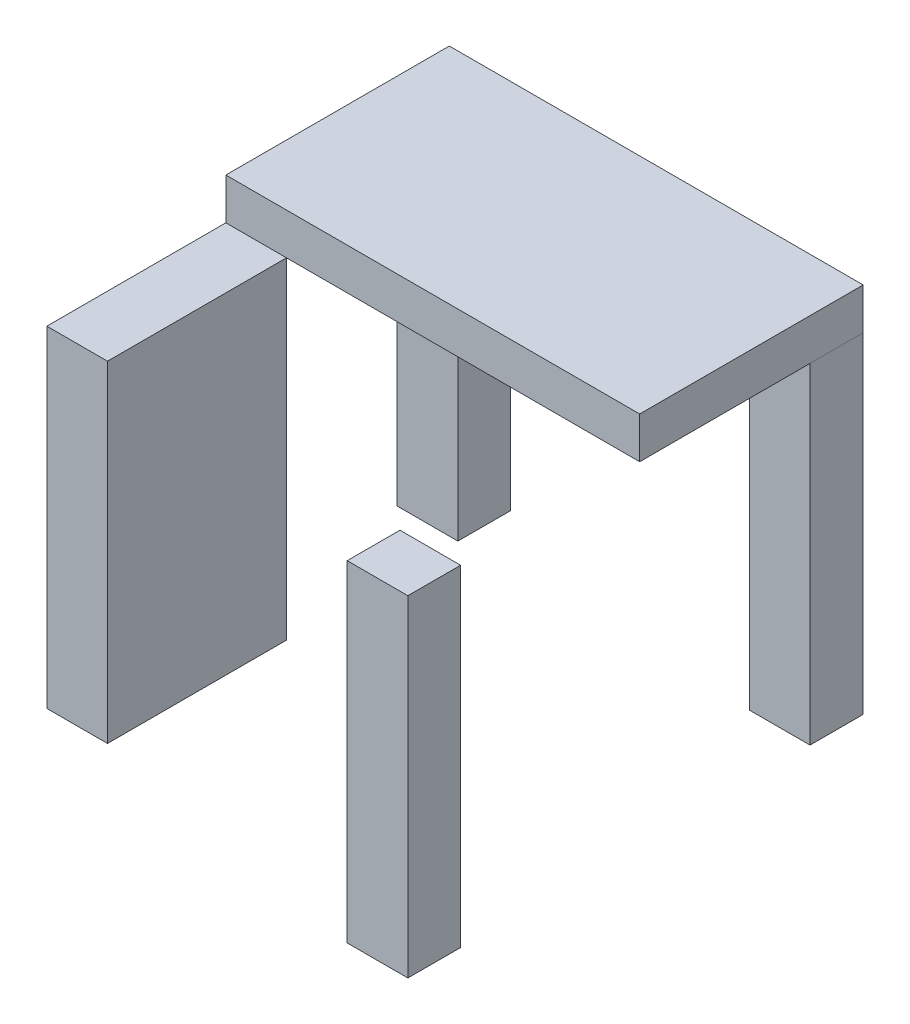
ISO-10303-21;
HEADER;
FILE_DESCRIPTION(('STEP AP214'),'2;1');
FILE_NAME('part.step','',(''),(''),'','','');
FILE_SCHEMA(('AUTOMOTIVE_DESIGN { 1 0 10303 214 1 1 1 1 }'));
ENDSEC;
DATA;
#1=APPLICATION_CONTEXT('core data for automotive mechanical design processes');
#2=APPLICATION_PROTOCOL_DEFINITION('international standard','automotive_design',2000,#1);
#3=PRODUCT_CONTEXT('',#1,'mechanical');
#4=PRODUCT('Part','Part','',(#3));
#5=PRODUCT_RELATED_PRODUCT_CATEGORY('part','',(#4));
#6=PRODUCT_DEFINITION_FORMATION('','',#4);
#7=PRODUCT_DEFINITION_CONTEXT('part definition',#1,'design');
#8=PRODUCT_DEFINITION('design','',#6,#7);
#9=PRODUCT_DEFINITION_SHAPE('','',#8);
#10=(LENGTH_UNIT() NAMED_UNIT(*) SI_UNIT(.MILLI.,.METRE.));
#11=(NAMED_UNIT(*) PLANE_ANGLE_UNIT() SI_UNIT($,.RADIAN.));
#12=(NAMED_UNIT(*) SI_UNIT($,.STERADIAN.) SOLID_ANGLE_UNIT());
#13=UNCERTAINTY_MEASURE_WITH_UNIT(LENGTH_MEASURE(1.E-05),#10,'distance_accuracy_value','');
#14=(GEOMETRIC_REPRESENTATION_CONTEXT(3) GLOBAL_UNCERTAINTY_ASSIGNED_CONTEXT((#13)) GLOBAL_UNIT_ASSIGNED_CONTEXT((#10,
#11,#12)) REPRESENTATION_CONTEXT('',''));
#15=CARTESIAN_POINT('',(0.,0.,0.));
#16=DIRECTION('',(0.,0.,1.));
#17=DIRECTION('',(1.,0.,0.));
#18=AXIS2_PLACEMENT_3D('',#15,#16,#17);
#19=CARTESIAN_POINT('',(85.36181093433,-80.,110.034688240795));
#20=DIRECTION('',(1.,0.,0.));
#21=DIRECTION('',(0.,0.,-1.));
#22=AXIS2_PLACEMENT_3D('',#19,#20,#21);
#23=PLANE('',#22);
#24=DIRECTION('',(0.,0.,-1.));
#25=VECTOR('',#24,1.);
#26=CARTESIAN_POINT('',(85.36181093433,0.,110.034688240795));
#27=LINE('',#26,#25);
#28=CARTESIAN_POINT('',(85.36181093433,0.,110.034688240795));
#29=VERTEX_POINT('',#28);
#30=CARTESIAN_POINT('',(85.36181093433,0.,97.2842820171065));
#31=VERTEX_POINT('',#30);
#32=EDGE_CURVE('E107',#29,#31,#27,.T.);
#33=ORIENTED_EDGE('',*,*,#32,.T.);
#34=DIRECTION('',(0.,1.,0.));
#35=VECTOR('',#34,1.);
#36=CARTESIAN_POINT('',(85.36181093433,-80.,97.2842820171065));
#37=LINE('',#36,#35);
#38=CARTESIAN_POINT('',(85.36181093433,-80.,97.2842820171065));
#39=VERTEX_POINT('',#38);
#40=EDGE_CURVE('E12',#39,#31,#37,.T.);
#41=ORIENTED_EDGE('',*,*,#40,.F.);
#42=DIRECTION('',(0.,0.,-1.));
#43=VECTOR('',#42,1.);
#44=CARTESIAN_POINT('',(85.36181093433,-80.,110.034688240795));
#45=LINE('',#44,#43);
#46=CARTESIAN_POINT('',(85.36181093433,-80.,110.034688240795));
#47=VERTEX_POINT('',#46);
#48=EDGE_CURVE('E95',#47,#39,#45,.T.);
#49=ORIENTED_EDGE('',*,*,#48,.F.);
#50=DIRECTION('',(0.,1.,0.));
#51=VECTOR('',#50,1.);
#52=CARTESIAN_POINT('',(85.36181093433,-80.,110.034688240795));
#53=LINE('',#52,#51);
#54=EDGE_CURVE('E103',#47,#29,#53,.T.);
#55=ORIENTED_EDGE('',*,*,#54,.T.);
#56=EDGE_LOOP('',(#33,#41,#49,#55));
#57=FACE_BOUND('',#56,.T.);
#58=ADVANCED_FACE('F44',(#57),#23,.F.);
#59=CARTESIAN_POINT('',(85.36181093433,-80.,97.2842820171065));
#60=DIRECTION('',(0.,0.,1.));
#61=DIRECTION('',(1.,0.,0.));
#62=AXIS2_PLACEMENT_3D('',#59,#60,#61);
#63=PLANE('',#62);
#64=DIRECTION('',(1.,0.,0.));
#65=VECTOR('',#64,1.);
#66=CARTESIAN_POINT('',(85.36181093433,0.,97.2842820171065));
#67=LINE('',#66,#65);
#68=CARTESIAN_POINT('',(100.019107271016,0.,97.2842820171065));
#69=VERTEX_POINT('',#68);
#70=EDGE_CURVE('E99',#31,#69,#67,.T.);
#71=ORIENTED_EDGE('',*,*,#70,.T.);
#72=DIRECTION('',(0.,1.,0.));
#73=VECTOR('',#72,1.);
#74=CARTESIAN_POINT('',(100.019107271016,-80.,97.2842820171065));
#75=LINE('',#74,#73);
#76=CARTESIAN_POINT('',(100.019107271016,-80.,97.2842820171065));
#77=VERTEX_POINT('',#76);
#78=EDGE_CURVE('E52',#77,#69,#75,.T.);
#79=ORIENTED_EDGE('',*,*,#78,.F.);
#80=DIRECTION('',(1.,0.,0.));
#81=VECTOR('',#80,1.);
#82=CARTESIAN_POINT('',(85.36181093433,-80.,97.2842820171065));
#83=LINE('',#82,#81);
#84=EDGE_CURVE('E90',#39,#77,#83,.T.);
#85=ORIENTED_EDGE('',*,*,#84,.F.);
#86=ORIENTED_EDGE('',*,*,#40,.T.);
#87=EDGE_LOOP('',(#71,#79,#85,#86));
#88=FACE_BOUND('',#87,.T.);
#89=ADVANCED_FACE('F98',(#88),#63,.F.);
#90=CARTESIAN_POINT('',(100.019107271016,-80.,110.034688240795));
#91=DIRECTION('',(-1.,0.,0.));
#92=DIRECTION('',(0.,0.,1.));
#93=AXIS2_PLACEMENT_3D('',#90,#91,#92);
#94=PLANE('',#93);
#95=DIRECTION('',(0.,0.,1.));
#96=VECTOR('',#95,1.);
#97=CARTESIAN_POINT('',(100.019107271016,0.,110.034688240795));
#98=LINE('',#97,#96);
#99=CARTESIAN_POINT('',(100.019107271016,0.,110.034688240795));
#100=VERTEX_POINT('',#99);
#101=EDGE_CURVE('E77',#69,#100,#98,.T.);
#102=ORIENTED_EDGE('',*,*,#101,.T.);
#103=DIRECTION('',(0.,1.,0.));
#104=VECTOR('',#103,1.);
#105=CARTESIAN_POINT('',(100.019107271016,-80.,110.034688240795));
#106=LINE('',#105,#104);
#107=CARTESIAN_POINT('',(100.019107271016,-80.,110.034688240795));
#108=VERTEX_POINT('',#107);
#109=EDGE_CURVE('E100',#108,#100,#106,.T.);
#110=ORIENTED_EDGE('',*,*,#109,.F.);
#111=DIRECTION('',(0.,0.,1.));
#112=VECTOR('',#111,1.);
#113=CARTESIAN_POINT('',(100.019107271016,-80.,110.034688240795));
#114=LINE('',#113,#112);
#115=EDGE_CURVE('E93',#77,#108,#114,.T.);
#116=ORIENTED_EDGE('',*,*,#115,.F.);
#117=ORIENTED_EDGE('',*,*,#78,.T.);
#118=EDGE_LOOP('',(#102,#110,#116,#117));
#119=FACE_BOUND('',#118,.T.);
#120=ADVANCED_FACE('F101',(#119),#94,.F.);
#121=CARTESIAN_POINT('',(85.36181093433,-80.,110.034688240795));
#122=DIRECTION('',(0.,0.,-1.));
#123=DIRECTION('',(-1.,0.,0.));
#124=AXIS2_PLACEMENT_3D('',#121,#122,#123);
#125=PLANE('',#124);
#126=DIRECTION('',(-1.,0.,0.));
#127=VECTOR('',#126,1.);
#128=CARTESIAN_POINT('',(85.36181093433,0.,110.034688240795));
#129=LINE('',#128,#127);
#130=EDGE_CURVE('E83',#100,#29,#129,.T.);
#131=ORIENTED_EDGE('',*,*,#130,.T.);
#132=ORIENTED_EDGE('',*,*,#54,.F.);
#133=DIRECTION('',(-1.,0.,0.));
#134=VECTOR('',#133,1.);
#135=CARTESIAN_POINT('',(85.36181093433,-80.,110.034688240795));
#136=LINE('',#135,#134);
#137=EDGE_CURVE('E60',#108,#47,#136,.T.);
#138=ORIENTED_EDGE('',*,*,#137,.F.);
#139=ORIENTED_EDGE('',*,*,#109,.T.);
#140=EDGE_LOOP('',(#131,#132,#138,#139));
#141=FACE_BOUND('',#140,.T.);
#142=ADVANCED_FACE('F114',(#141),#125,.F.);
#143=CARTESIAN_POINT('',(0.,-80.,0.));
#144=DIRECTION('',(0.,-1.,0.));
#145=DIRECTION('',(0.,0.,-1.));
#146=AXIS2_PLACEMENT_3D('',#143,#144,#145);
#147=PLANE('',#146);
#148=ORIENTED_EDGE('',*,*,#48,.T.);
#149=ORIENTED_EDGE('',*,*,#84,.T.);
#150=ORIENTED_EDGE('',*,*,#115,.T.);
#151=ORIENTED_EDGE('',*,*,#137,.T.);
#152=EDGE_LOOP('',(#148,#149,#150,#151));
#153=FACE_BOUND('',#152,.T.);
#154=ADVANCED_FACE('F91',(#153),#147,.T.);
#155=CARTESIAN_POINT('',(0.,0.,0.));
#156=DIRECTION('',(0.,-1.,0.));
#157=DIRECTION('',(0.,0.,-1.));
#158=AXIS2_PLACEMENT_3D('',#155,#156,#157);
#159=PLANE('',#158);
#160=ORIENTED_EDGE('',*,*,#32,.F.);
#161=ORIENTED_EDGE('',*,*,#130,.F.);
#162=ORIENTED_EDGE('',*,*,#101,.F.);
#163=ORIENTED_EDGE('',*,*,#70,.F.);
#164=EDGE_LOOP('',(#160,#161,#162,#163));
#165=FACE_BOUND('',#164,.T.);
#166=ADVANCED_FACE('F117',(#165),#159,.F.);
#167=CLOSED_SHELL('',(#58,#89,#120,#142,#154,#166));
#168=MANIFOLD_SOLID_BREP('B2',#167);
#169=CARTESIAN_POINT('',(0.,-80.,54.));
#170=DIRECTION('',(1.,0.,0.));
#171=DIRECTION('',(0.,0.,-1.));
#172=AXIS2_PLACEMENT_3D('',#169,#170,#171);
#173=PLANE('',#172);
#174=DIRECTION('',(0.,0.,-1.));
#175=VECTOR('',#174,1.);
#176=CARTESIAN_POINT('',(0.,0.,54.));
#177=LINE('',#176,#175);
#178=CARTESIAN_POINT('',(0.,0.,97.2495937763114));
#179=VERTEX_POINT('',#178);
#180=CARTESIAN_POINT('',(0.,0.,54.));
#181=VERTEX_POINT('',#180);
#182=EDGE_CURVE('E240',#179,#181,#177,.T.);
#183=ORIENTED_EDGE('',*,*,#182,.T.);
#184=DIRECTION('',(0.,1.,0.));
#185=VECTOR('',#184,1.);
#186=CARTESIAN_POINT('',(0.,-80.,54.));
#187=LINE('',#186,#185);
#188=CARTESIAN_POINT('',(0.,-80.,54.));
#189=VERTEX_POINT('',#188);
#190=EDGE_CURVE('E42',#189,#181,#187,.T.);
#191=ORIENTED_EDGE('',*,*,#190,.F.);
#192=DIRECTION('',(0.,0.,-1.));
#193=VECTOR('',#192,1.);
#194=CARTESIAN_POINT('',(0.,-80.,54.));
#195=LINE('',#194,#193);
#196=CARTESIAN_POINT('',(0.,-80.,97.2495937763114));
#197=VERTEX_POINT('',#196);
#198=EDGE_CURVE('E228',#197,#189,#195,.T.);
#199=ORIENTED_EDGE('',*,*,#198,.F.);
#200=DIRECTION('',(0.,1.,0.));
#201=VECTOR('',#200,1.);
#202=CARTESIAN_POINT('',(0.,-80.,97.2495937763114));
#203=LINE('',#202,#201);
#204=EDGE_CURVE('E236',#197,#179,#203,.T.);
#205=ORIENTED_EDGE('',*,*,#204,.T.);
#206=EDGE_LOOP('',(#183,#191,#199,#205));
#207=FACE_BOUND('',#206,.T.);
#208=ADVANCED_FACE('F177',(#207),#173,.F.);
#209=CARTESIAN_POINT('',(0.,-80.,54.));
#210=DIRECTION('',(0.,0.,1.));
#211=DIRECTION('',(1.,0.,0.));
#212=AXIS2_PLACEMENT_3D('',#209,#210,#211);
#213=PLANE('',#212);
#214=DIRECTION('',(1.,0.,0.));
#215=VECTOR('',#214,1.);
#216=CARTESIAN_POINT('',(0.,0.,54.));
#217=LINE('',#216,#215);
#218=CARTESIAN_POINT('',(14.6572963366857,0.,54.));
#219=VERTEX_POINT('',#218);
#220=EDGE_CURVE('E232',#181,#219,#217,.T.);
#221=ORIENTED_EDGE('',*,*,#220,.T.);
#222=DIRECTION('',(0.,1.,0.));
#223=VECTOR('',#222,1.);
#224=CARTESIAN_POINT('',(14.6572963366857,-80.,54.));
#225=LINE('',#224,#223);
#226=CARTESIAN_POINT('',(14.6572963366857,-80.,54.));
#227=VERTEX_POINT('',#226);
#228=EDGE_CURVE('E185',#227,#219,#225,.T.);
#229=ORIENTED_EDGE('',*,*,#228,.F.);
#230=DIRECTION('',(1.,0.,0.));
#231=VECTOR('',#230,1.);
#232=CARTESIAN_POINT('',(0.,-80.,54.));
#233=LINE('',#232,#231);
#234=EDGE_CURVE('E223',#189,#227,#233,.T.);
#235=ORIENTED_EDGE('',*,*,#234,.F.);
#236=ORIENTED_EDGE('',*,*,#190,.T.);
#237=EDGE_LOOP('',(#221,#229,#235,#236));
#238=FACE_BOUND('',#237,.T.);
#239=ADVANCED_FACE('F231',(#238),#213,.F.);
#240=CARTESIAN_POINT('',(14.6572963366857,-80.,54.));
#241=DIRECTION('',(-1.,0.,0.));
#242=DIRECTION('',(0.,0.,1.));
#243=AXIS2_PLACEMENT_3D('',#240,#241,#242);
#244=PLANE('',#243);
#245=DIRECTION('',(0.,0.,1.));
#246=VECTOR('',#245,1.);
#247=CARTESIAN_POINT('',(14.6572963366857,0.,54.));
#248=LINE('',#247,#246);
#249=CARTESIAN_POINT('',(14.6572963366857,0.,97.2495937763114));
#250=VERTEX_POINT('',#249);
#251=EDGE_CURVE('E210',#219,#250,#248,.T.);
#252=ORIENTED_EDGE('',*,*,#251,.T.);
#253=DIRECTION('',(0.,1.,0.));
#254=VECTOR('',#253,1.);
#255=CARTESIAN_POINT('',(14.6572963366857,-80.,97.2495937763114));
#256=LINE('',#255,#254);
#257=CARTESIAN_POINT('',(14.6572963366857,-80.,97.2495937763114));
#258=VERTEX_POINT('',#257);
#259=EDGE_CURVE('E233',#258,#250,#256,.T.);
#260=ORIENTED_EDGE('',*,*,#259,.F.);
#261=DIRECTION('',(0.,0.,1.));
#262=VECTOR('',#261,1.);
#263=CARTESIAN_POINT('',(14.6572963366857,-80.,54.));
#264=LINE('',#263,#262);
#265=EDGE_CURVE('E226',#227,#258,#264,.T.);
#266=ORIENTED_EDGE('',*,*,#265,.F.);
#267=ORIENTED_EDGE('',*,*,#228,.T.);
#268=EDGE_LOOP('',(#252,#260,#266,#267));
#269=FACE_BOUND('',#268,.T.);
#270=ADVANCED_FACE('F234',(#269),#244,.F.);
#271=CARTESIAN_POINT('',(0.,-80.,97.2495937763114));
#272=DIRECTION('',(0.,0.,-1.));
#273=DIRECTION('',(-1.,0.,0.));
#274=AXIS2_PLACEMENT_3D('',#271,#272,#273);
#275=PLANE('',#274);
#276=DIRECTION('',(-1.,0.,0.));
#277=VECTOR('',#276,1.);
#278=CARTESIAN_POINT('',(0.,0.,97.2495937763114));
#279=LINE('',#278,#277);
#280=EDGE_CURVE('E216',#250,#179,#279,.T.);
#281=ORIENTED_EDGE('',*,*,#280,.T.);
#282=ORIENTED_EDGE('',*,*,#204,.F.);
#283=DIRECTION('',(-1.,0.,0.));
#284=VECTOR('',#283,1.);
#285=CARTESIAN_POINT('',(0.,-80.,97.2495937763114));
#286=LINE('',#285,#284);
#287=EDGE_CURVE('E193',#258,#197,#286,.T.);
#288=ORIENTED_EDGE('',*,*,#287,.F.);
#289=ORIENTED_EDGE('',*,*,#259,.T.);
#290=EDGE_LOOP('',(#281,#282,#288,#289));
#291=FACE_BOUND('',#290,.T.);
#292=ADVANCED_FACE('F247',(#291),#275,.F.);
#293=CARTESIAN_POINT('',(0.,-80.,0.));
#294=DIRECTION('',(0.,1.,0.));
#295=DIRECTION('',(0.,0.,1.));
#296=AXIS2_PLACEMENT_3D('',#293,#294,#295);
#297=PLANE('',#296);
#298=ORIENTED_EDGE('',*,*,#198,.T.);
#299=ORIENTED_EDGE('',*,*,#234,.T.);
#300=ORIENTED_EDGE('',*,*,#265,.T.);
#301=ORIENTED_EDGE('',*,*,#287,.T.);
#302=EDGE_LOOP('',(#298,#299,#300,#301));
#303=FACE_BOUND('',#302,.T.);
#304=ADVANCED_FACE('F224',(#303),#297,.F.);
#305=CARTESIAN_POINT('',(0.,0.,0.));
#306=DIRECTION('',(0.,1.,0.));
#307=DIRECTION('',(0.,0.,1.));
#308=AXIS2_PLACEMENT_3D('',#305,#306,#307);
#309=PLANE('',#308);
#310=ORIENTED_EDGE('',*,*,#182,.F.);
#311=ORIENTED_EDGE('',*,*,#280,.F.);
#312=ORIENTED_EDGE('',*,*,#251,.F.);
#313=ORIENTED_EDGE('',*,*,#220,.F.);
#314=EDGE_LOOP('',(#310,#311,#312,#313));
#315=FACE_BOUND('',#314,.T.);
#316=ADVANCED_FACE('F250',(#315),#309,.T.);
#317=CLOSED_SHELL('',(#208,#239,#270,#292,#304,#316));
#318=MANIFOLD_SOLID_BREP('B6',#317);
#319=CARTESIAN_POINT('',(0.,0.,54.));
#320=DIRECTION('',(0.,1.,0.));
#321=DIRECTION('',(0.,0.,1.));
#322=AXIS2_PLACEMENT_3D('',#319,#320,#321);
#323=PLANE('',#322);
#324=DIRECTION('',(0.,0.,-1.));
#325=VECTOR('',#324,1.);
#326=CARTESIAN_POINT('',(85.2148558255428,0.,12.7157179828936));
#327=LINE('',#326,#325);
#328=CARTESIAN_POINT('',(85.2148558255428,0.,12.7157179828936));
#329=VERTEX_POINT('',#328);
#330=CARTESIAN_POINT('',(85.2148558255428,0.,0.));
#331=VERTEX_POINT('',#330);
#332=EDGE_CURVE('E318',#329,#331,#327,.T.);
#333=ORIENTED_EDGE('',*,*,#332,.F.);
#334=DIRECTION('',(-1.,0.,0.));
#335=VECTOR('',#334,1.);
#336=CARTESIAN_POINT('',(85.2148558255428,0.,12.7157179828936));
#337=LINE('',#336,#335);
#338=CARTESIAN_POINT('',(99.8721521622285,0.,12.7157179828936));
#339=VERTEX_POINT('',#338);
#340=EDGE_CURVE('E322',#339,#329,#337,.T.);
#341=ORIENTED_EDGE('',*,*,#340,.F.);
#342=DIRECTION('',(0.,0.,1.));
#343=VECTOR('',#342,1.);
#344=CARTESIAN_POINT('',(99.8721521622285,0.,12.7157179828936));
#345=LINE('',#344,#343);
#346=CARTESIAN_POINT('',(99.8721521622285,0.,0.));
#347=VERTEX_POINT('',#346);
#348=EDGE_CURVE('E647',#347,#339,#345,.T.);
#349=ORIENTED_EDGE('',*,*,#348,.F.);
#350=DIRECTION('',(1.,0.,0.));
#351=VECTOR('',#350,1.);
#352=CARTESIAN_POINT('',(0.,0.,0.));
#353=LINE('',#352,#351);
#354=CARTESIAN_POINT('',(100.,0.,0.));
#355=VERTEX_POINT('',#354);
#356=EDGE_CURVE('E478',#347,#355,#353,.T.);
#357=ORIENTED_EDGE('',*,*,#356,.T.);
#358=DIRECTION('',(0.,0.,-1.));
#359=VECTOR('',#358,1.);
#360=CARTESIAN_POINT('',(100.,0.,54.));
#361=LINE('',#360,#359);
#362=CARTESIAN_POINT('',(100.,0.,54.));
#363=VERTEX_POINT('',#362);
#364=EDGE_CURVE('E490',#363,#355,#361,.T.);
#365=ORIENTED_EDGE('',*,*,#364,.F.);
#366=DIRECTION('',(1.,0.,0.));
#367=VECTOR('',#366,1.);
#368=CARTESIAN_POINT('',(0.,0.,54.));
#369=LINE('',#368,#367);
#370=CARTESIAN_POINT('',(0.,0.,54.));
#371=VERTEX_POINT('',#370);
#372=EDGE_CURVE('E468',#371,#363,#369,.T.);
#373=ORIENTED_EDGE('',*,*,#372,.F.);
#374=DIRECTION('',(0.,0.,-1.));
#375=VECTOR('',#374,1.);
#376=CARTESIAN_POINT('',(0.,0.,54.));
#377=LINE('',#376,#375);
#378=CARTESIAN_POINT('',(0.,0.,12.5687628741064));
#379=VERTEX_POINT('',#378);
#380=EDGE_CURVE('E305',#371,#379,#377,.T.);
#381=ORIENTED_EDGE('',*,*,#380,.T.);
#382=DIRECTION('',(-1.,0.,0.));
#383=VECTOR('',#382,1.);
#384=CARTESIAN_POINT('',(-0.0191072710157194,0.,12.5687628741064));
#385=LINE('',#384,#383);
#386=CARTESIAN_POINT('',(14.63818906567,0.,12.5687628741064));
#387=VERTEX_POINT('',#386);
#388=EDGE_CURVE('E441',#387,#379,#385,.T.);
#389=ORIENTED_EDGE('',*,*,#388,.F.);
#390=DIRECTION('',(0.,0.,1.));
#391=VECTOR('',#390,1.);
#392=CARTESIAN_POINT('',(14.63818906567,0.,12.5687628741064));
#393=LINE('',#392,#391);
#394=CARTESIAN_POINT('',(14.63818906567,0.,0.));
#395=VERTEX_POINT('',#394);
#396=EDGE_CURVE('E175',#395,#387,#393,.T.);
#397=ORIENTED_EDGE('',*,*,#396,.F.);
#398=EDGE_CURVE('E483',#395,#331,#353,.T.);
#399=ORIENTED_EDGE('',*,*,#398,.T.);
#400=EDGE_LOOP('',(#333,#341,#349,#357,#365,#373,#381,#389,#397,#399));
#401=FACE_BOUND('',#400,.T.);
#402=ADVANCED_FACE('F301',(#401),#323,.F.);
#403=CARTESIAN_POINT('',(0.,0.,54.));
#404=DIRECTION('',(1.,0.,0.));
#405=DIRECTION('',(0.,0.,-1.));
#406=AXIS2_PLACEMENT_3D('',#403,#404,#405);
#407=PLANE('',#406);
#408=DIRECTION('',(0.,-1.,0.));
#409=VECTOR('',#408,1.);
#410=CARTESIAN_POINT('',(0.,0.,0.));
#411=LINE('',#410,#409);
#412=CARTESIAN_POINT('',(0.,10.,0.));
#413=VERTEX_POINT('',#412);
#414=CARTESIAN_POINT('',(0.,0.,0.));
#415=VERTEX_POINT('',#414);
#416=EDGE_CURVE('E464',#413,#415,#411,.T.);
#417=ORIENTED_EDGE('',*,*,#416,.T.);
#418=EDGE_CURVE('E492',#379,#415,#377,.T.);
#419=ORIENTED_EDGE('',*,*,#418,.F.);
#420=ORIENTED_EDGE('',*,*,#380,.F.);
#421=DIRECTION('',(0.,-1.,0.));
#422=VECTOR('',#421,1.);
#423=CARTESIAN_POINT('',(0.,0.,54.));
#424=LINE('',#423,#422);
#425=CARTESIAN_POINT('',(0.,10.,54.));
#426=VERTEX_POINT('',#425);
#427=EDGE_CURVE('E465',#426,#371,#424,.T.);
#428=ORIENTED_EDGE('',*,*,#427,.F.);
#429=DIRECTION('',(0.,0.,-1.));
#430=VECTOR('',#429,1.);
#431=CARTESIAN_POINT('',(0.,10.,54.));
#432=LINE('',#431,#430);
#433=EDGE_CURVE('E475',#426,#413,#432,.T.);
#434=ORIENTED_EDGE('',*,*,#433,.T.);
#435=EDGE_LOOP('',(#417,#419,#420,#428,#434));
#436=FACE_BOUND('',#435,.T.);
#437=ADVANCED_FACE('F303',(#436),#407,.F.);
#438=CARTESIAN_POINT('',(100.,0.,54.));
#439=DIRECTION('',(-1.,0.,0.));
#440=DIRECTION('',(0.,0.,1.));
#441=AXIS2_PLACEMENT_3D('',#438,#439,#440);
#442=PLANE('',#441);
#443=DIRECTION('',(0.,1.,0.));
#444=VECTOR('',#443,1.);
#445=CARTESIAN_POINT('',(100.,0.,0.));
#446=LINE('',#445,#444);
#447=CARTESIAN_POINT('',(100.,10.,0.));
#448=VERTEX_POINT('',#447);
#449=EDGE_CURVE('E482',#355,#448,#446,.T.);
#450=ORIENTED_EDGE('',*,*,#449,.T.);
#451=DIRECTION('',(0.,0.,-1.));
#452=VECTOR('',#451,1.);
#453=CARTESIAN_POINT('',(100.,10.,54.));
#454=LINE('',#453,#452);
#455=CARTESIAN_POINT('',(100.,10.,54.));
#456=VERTEX_POINT('',#455);
#457=EDGE_CURVE('E488',#456,#448,#454,.T.);
#458=ORIENTED_EDGE('',*,*,#457,.F.);
#459=DIRECTION('',(0.,1.,0.));
#460=VECTOR('',#459,1.);
#461=CARTESIAN_POINT('',(100.,0.,54.));
#462=LINE('',#461,#460);
#463=EDGE_CURVE('E471',#363,#456,#462,.T.);
#464=ORIENTED_EDGE('',*,*,#463,.F.);
#465=ORIENTED_EDGE('',*,*,#364,.T.);
#466=EDGE_LOOP('',(#450,#458,#464,#465));
#467=FACE_BOUND('',#466,.T.);
#468=ADVANCED_FACE('F543',(#467),#442,.F.);
#469=CARTESIAN_POINT('',(0.,10.,54.));
#470=DIRECTION('',(0.,-1.,0.));
#471=DIRECTION('',(0.,0.,-1.));
#472=AXIS2_PLACEMENT_3D('',#469,#470,#471);
#473=PLANE('',#472);
#474=DIRECTION('',(-1.,0.,0.));
#475=VECTOR('',#474,1.);
#476=CARTESIAN_POINT('',(0.,10.,0.));
#477=LINE('',#476,#475);
#478=EDGE_CURVE('E469',#448,#413,#477,.T.);
#479=ORIENTED_EDGE('',*,*,#478,.T.);
#480=ORIENTED_EDGE('',*,*,#433,.F.);
#481=DIRECTION('',(-1.,0.,0.));
#482=VECTOR('',#481,1.);
#483=CARTESIAN_POINT('',(0.,10.,54.));
#484=LINE('',#483,#482);
#485=EDGE_CURVE('E473',#456,#426,#484,.T.);
#486=ORIENTED_EDGE('',*,*,#485,.F.);
#487=ORIENTED_EDGE('',*,*,#457,.T.);
#488=EDGE_LOOP('',(#479,#480,#486,#487));
#489=FACE_BOUND('',#488,.T.);
#490=ADVANCED_FACE('F547',(#489),#473,.F.);
#491=CARTESIAN_POINT('',(0.,0.,54.));
#492=DIRECTION('',(0.,0.,-1.));
#493=DIRECTION('',(-1.,0.,0.));
#494=AXIS2_PLACEMENT_3D('',#491,#492,#493);
#495=PLANE('',#494);
#496=ORIENTED_EDGE('',*,*,#427,.T.);
#497=ORIENTED_EDGE('',*,*,#372,.T.);
#498=ORIENTED_EDGE('',*,*,#463,.T.);
#499=ORIENTED_EDGE('',*,*,#485,.T.);
#500=EDGE_LOOP('',(#496,#497,#498,#499));
#501=FACE_BOUND('',#500,.T.);
#502=ADVANCED_FACE('F550',(#501),#495,.F.);
#503=CARTESIAN_POINT('',(0.,0.,0.));
#504=DIRECTION('',(0.,0.,-1.));
#505=DIRECTION('',(-1.,0.,0.));
#506=AXIS2_PLACEMENT_3D('',#503,#504,#505);
#507=PLANE('',#506);
#508=ORIENTED_EDGE('',*,*,#416,.F.);
#509=ORIENTED_EDGE('',*,*,#478,.F.);
#510=ORIENTED_EDGE('',*,*,#449,.F.);
#511=ORIENTED_EDGE('',*,*,#356,.F.);
#512=EDGE_CURVE('E520',#331,#347,#353,.T.);
#513=ORIENTED_EDGE('',*,*,#512,.F.);
#514=ORIENTED_EDGE('',*,*,#398,.F.);
#515=EDGE_CURVE('E479',#415,#395,#353,.T.);
#516=ORIENTED_EDGE('',*,*,#515,.F.);
#517=EDGE_LOOP('',(#508,#509,#510,#511,#513,#514,#516));
#518=FACE_BOUND('',#517,.T.);
#519=ADVANCED_FACE('F518',(#518),#507,.T.);
#520=CARTESIAN_POINT('',(0.,0.,0.));
#521=DIRECTION('',(0.,-1.,0.));
#522=DIRECTION('',(0.,0.,-1.));
#523=AXIS2_PLACEMENT_3D('',#520,#521,#522);
#524=PLANE('',#523);
#525=ORIENTED_EDGE('',*,*,#418,.T.);
#526=ORIENTED_EDGE('',*,*,#515,.T.);
#527=CARTESIAN_POINT('',(14.63818906567,0.,-0.181643349582247));
#528=VERTEX_POINT('',#527);
#529=EDGE_CURVE('E311',#528,#395,#393,.T.);
#530=ORIENTED_EDGE('',*,*,#529,.F.);
#531=DIRECTION('',(1.,0.,0.));
#532=VECTOR('',#531,1.);
#533=CARTESIAN_POINT('',(-0.0191072710157177,0.,-0.181643349582247));
#534=LINE('',#533,#532);
#535=CARTESIAN_POINT('',(-0.0191072710157177,0.,-0.181643349582247));
#536=VERTEX_POINT('',#535);
#537=EDGE_CURVE('E431',#536,#528,#534,.T.);
#538=ORIENTED_EDGE('',*,*,#537,.F.);
#539=DIRECTION('',(0.,0.,-1.));
#540=VECTOR('',#539,1.);
#541=CARTESIAN_POINT('',(-0.0191072710157194,0.,12.5687628741064));
#542=LINE('',#541,#540);
#543=CARTESIAN_POINT('',(-0.0191072710157194,0.,12.5687628741064));
#544=VERTEX_POINT('',#543);
#545=EDGE_CURVE('E428',#544,#536,#542,.T.);
#546=ORIENTED_EDGE('',*,*,#545,.F.);
#547=EDGE_CURVE('E450',#379,#544,#385,.T.);
#548=ORIENTED_EDGE('',*,*,#547,.F.);
#549=EDGE_LOOP('',(#525,#526,#530,#538,#546,#548));
#550=FACE_BOUND('',#549,.T.);
#551=ADVANCED_FACE('F505',(#550),#524,.F.);
#552=CARTESIAN_POINT('',(-0.0191072710157194,-80.,12.5687628741064));
#553=DIRECTION('',(1.,0.,0.));
#554=DIRECTION('',(0.,0.,-1.));
#555=AXIS2_PLACEMENT_3D('',#552,#553,#554);
#556=PLANE('',#555);
#557=ORIENTED_EDGE('',*,*,#545,.T.);
#558=DIRECTION('',(0.,1.,0.));
#559=VECTOR('',#558,1.);
#560=CARTESIAN_POINT('',(-0.0191072710157177,-80.,-0.181643349582247));
#561=LINE('',#560,#559);
#562=CARTESIAN_POINT('',(-0.0191072710157177,-80.,-0.181643349582247));
#563=VERTEX_POINT('',#562);
#564=EDGE_CURVE('E461',#563,#536,#561,.T.);
#565=ORIENTED_EDGE('',*,*,#564,.F.);
#566=DIRECTION('',(0.,0.,-1.));
#567=VECTOR('',#566,1.);
#568=CARTESIAN_POINT('',(-0.0191072710157194,-80.,12.5687628741064));
#569=LINE('',#568,#567);
#570=CARTESIAN_POINT('',(-0.0191072710157194,-80.,12.5687628741064));
#571=VERTEX_POINT('',#570);
#572=EDGE_CURVE('E437',#571,#563,#569,.T.);
#573=ORIENTED_EDGE('',*,*,#572,.F.);
#574=DIRECTION('',(0.,1.,0.));
#575=VECTOR('',#574,1.);
#576=CARTESIAN_POINT('',(-0.0191072710157194,-80.,12.5687628741064));
#577=LINE('',#576,#575);
#578=EDGE_CURVE('E446',#571,#544,#577,.T.);
#579=ORIENTED_EDGE('',*,*,#578,.T.);
#580=EDGE_LOOP('',(#557,#565,#573,#579));
#581=FACE_BOUND('',#580,.T.);
#582=ADVANCED_FACE('F527',(#581),#556,.F.);
#583=CARTESIAN_POINT('',(-0.0191072710157177,-80.,-0.181643349582247));
#584=DIRECTION('',(0.,0.,1.));
#585=DIRECTION('',(1.,0.,0.));
#586=AXIS2_PLACEMENT_3D('',#583,#584,#585);
#587=PLANE('',#586);
#588=ORIENTED_EDGE('',*,*,#537,.T.);
#589=DIRECTION('',(0.,1.,0.));
#590=VECTOR('',#589,1.);
#591=CARTESIAN_POINT('',(14.63818906567,-80.,-0.181643349582247));
#592=LINE('',#591,#590);
#593=CARTESIAN_POINT('',(14.63818906567,-80.,-0.181643349582247));
#594=VERTEX_POINT('',#593);
#595=EDGE_CURVE('E458',#594,#528,#592,.T.);
#596=ORIENTED_EDGE('',*,*,#595,.F.);
#597=DIRECTION('',(1.,0.,0.));
#598=VECTOR('',#597,1.);
#599=CARTESIAN_POINT('',(-0.0191072710157177,-80.,-0.181643349582247));
#600=LINE('',#599,#598);
#601=EDGE_CURVE('E440',#563,#594,#600,.T.);
#602=ORIENTED_EDGE('',*,*,#601,.F.);
#603=ORIENTED_EDGE('',*,*,#564,.T.);
#604=EDGE_LOOP('',(#588,#596,#602,#603));
#605=FACE_BOUND('',#604,.T.);
#606=ADVANCED_FACE('F524',(#605),#587,.F.);
#607=CARTESIAN_POINT('',(14.63818906567,-80.,12.5687628741064));
#608=DIRECTION('',(-1.,0.,0.));
#609=DIRECTION('',(0.,0.,1.));
#610=AXIS2_PLACEMENT_3D('',#607,#608,#609);
#611=PLANE('',#610);
#612=ORIENTED_EDGE('',*,*,#529,.T.);
#613=ORIENTED_EDGE('',*,*,#396,.T.);
#614=DIRECTION('',(0.,1.,0.));
#615=VECTOR('',#614,1.);
#616=CARTESIAN_POINT('',(14.63818906567,-80.,12.5687628741064));
#617=LINE('',#616,#615);
#618=CARTESIAN_POINT('',(14.63818906567,-80.,12.5687628741064));
#619=VERTEX_POINT('',#618);
#620=EDGE_CURVE('E455',#619,#387,#617,.T.);
#621=ORIENTED_EDGE('',*,*,#620,.F.);
#622=DIRECTION('',(0.,0.,1.));
#623=VECTOR('',#622,1.);
#624=CARTESIAN_POINT('',(14.63818906567,-80.,12.5687628741064));
#625=LINE('',#624,#623);
#626=EDGE_CURVE('E443',#594,#619,#625,.T.);
#627=ORIENTED_EDGE('',*,*,#626,.F.);
#628=ORIENTED_EDGE('',*,*,#595,.T.);
#629=EDGE_LOOP('',(#612,#613,#621,#627,#628));
#630=FACE_BOUND('',#629,.T.);
#631=ADVANCED_FACE('F513',(#630),#611,.F.);
#632=CARTESIAN_POINT('',(-0.0191072710157194,-80.,12.5687628741064));
#633=DIRECTION('',(0.,0.,-1.));
#634=DIRECTION('',(-1.,0.,0.));
#635=AXIS2_PLACEMENT_3D('',#632,#633,#634);
#636=PLANE('',#635);
#637=ORIENTED_EDGE('',*,*,#388,.T.);
#638=ORIENTED_EDGE('',*,*,#547,.T.);
#639=ORIENTED_EDGE('',*,*,#578,.F.);
#640=DIRECTION('',(-1.,0.,0.));
#641=VECTOR('',#640,1.);
#642=CARTESIAN_POINT('',(-0.0191072710157194,-80.,12.5687628741064));
#643=LINE('',#642,#641);
#644=EDGE_CURVE('E445',#619,#571,#643,.T.);
#645=ORIENTED_EDGE('',*,*,#644,.F.);
#646=ORIENTED_EDGE('',*,*,#620,.T.);
#647=EDGE_LOOP('',(#637,#638,#639,#645,#646));
#648=FACE_BOUND('',#647,.T.);
#649=ADVANCED_FACE('F508',(#648),#636,.F.);
#650=CARTESIAN_POINT('',(0.,-80.,0.));
#651=DIRECTION('',(0.,-1.,0.));
#652=DIRECTION('',(0.,0.,-1.));
#653=AXIS2_PLACEMENT_3D('',#650,#651,#652);
#654=PLANE('',#653);
#655=ORIENTED_EDGE('',*,*,#572,.T.);
#656=ORIENTED_EDGE('',*,*,#601,.T.);
#657=ORIENTED_EDGE('',*,*,#626,.T.);
#658=ORIENTED_EDGE('',*,*,#644,.T.);
#659=EDGE_LOOP('',(#655,#656,#657,#658));
#660=FACE_BOUND('',#659,.T.);
#661=ADVANCED_FACE('F529',(#660),#654,.T.);
#662=CARTESIAN_POINT('',(85.2148558255428,-80.,12.7157179828936));
#663=DIRECTION('',(1.,0.,0.));
#664=DIRECTION('',(0.,0.,-1.));
#665=AXIS2_PLACEMENT_3D('',#662,#663,#664);
#666=PLANE('',#665);
#667=ORIENTED_EDGE('',*,*,#332,.T.);
#668=CARTESIAN_POINT('',(85.2148558255428,0.,-0.0346882407950694));
#669=VERTEX_POINT('',#668);
#670=EDGE_CURVE('E426',#331,#669,#327,.T.);
#671=ORIENTED_EDGE('',*,*,#670,.T.);
#672=DIRECTION('',(0.,1.,0.));
#673=VECTOR('',#672,1.);
#674=CARTESIAN_POINT('',(85.2148558255428,-80.,-0.0346882407950694));
#675=LINE('',#674,#673);
#676=CARTESIAN_POINT('',(85.2148558255428,-80.,-0.0346882407950694));
#677=VERTEX_POINT('',#676);
#678=EDGE_CURVE('E408',#677,#669,#675,.T.);
#679=ORIENTED_EDGE('',*,*,#678,.F.);
#680=DIRECTION('',(0.,0.,-1.));
#681=VECTOR('',#680,1.);
#682=CARTESIAN_POINT('',(85.2148558255428,-80.,12.7157179828936));
#683=LINE('',#682,#681);
#684=CARTESIAN_POINT('',(85.2148558255428,-80.,12.7157179828936));
#685=VERTEX_POINT('',#684);
#686=EDGE_CURVE('E414',#685,#677,#683,.T.);
#687=ORIENTED_EDGE('',*,*,#686,.F.);
#688=DIRECTION('',(0.,1.,0.));
#689=VECTOR('',#688,1.);
#690=CARTESIAN_POINT('',(85.2148558255428,-80.,12.7157179828936));
#691=LINE('',#690,#689);
#692=EDGE_CURVE('E655',#685,#329,#691,.T.);
#693=ORIENTED_EDGE('',*,*,#692,.T.);
#694=EDGE_LOOP('',(#667,#671,#679,#687,#693));
#695=FACE_BOUND('',#694,.T.);
#696=ADVANCED_FACE('F424',(#695),#666,.F.);
#697=CARTESIAN_POINT('',(85.2148558255428,-80.,-0.0346882407950694));
#698=DIRECTION('',(0.,0.,1.));
#699=DIRECTION('',(1.,0.,0.));
#700=AXIS2_PLACEMENT_3D('',#697,#698,#699);
#701=PLANE('',#700);
#702=DIRECTION('',(1.,0.,0.));
#703=VECTOR('',#702,1.);
#704=CARTESIAN_POINT('',(85.2148558255428,0.,-0.0346882407950694));
#705=LINE('',#704,#703);
#706=CARTESIAN_POINT('',(99.8721521622285,0.,-0.0346882407950694));
#707=VERTEX_POINT('',#706);
#708=EDGE_CURVE('E651',#669,#707,#705,.T.);
#709=ORIENTED_EDGE('',*,*,#708,.T.);
#710=DIRECTION('',(0.,1.,0.));
#711=VECTOR('',#710,1.);
#712=CARTESIAN_POINT('',(99.8721521622285,-80.,-0.0346882407950694));
#713=LINE('',#712,#711);
#714=CARTESIAN_POINT('',(99.8721521622285,-80.,-0.0346882407950694));
#715=VERTEX_POINT('',#714);
#716=EDGE_CURVE('E410',#715,#707,#713,.T.);
#717=ORIENTED_EDGE('',*,*,#716,.F.);
#718=DIRECTION('',(1.,0.,0.));
#719=VECTOR('',#718,1.);
#720=CARTESIAN_POINT('',(85.2148558255428,-80.,-0.0346882407950694));
#721=LINE('',#720,#719);
#722=EDGE_CURVE('E404',#677,#715,#721,.T.);
#723=ORIENTED_EDGE('',*,*,#722,.F.);
#724=ORIENTED_EDGE('',*,*,#678,.T.);
#725=EDGE_LOOP('',(#709,#717,#723,#724));
#726=FACE_BOUND('',#725,.T.);
#727=ADVANCED_FACE('F406',(#726),#701,.F.);
#728=CARTESIAN_POINT('',(99.8721521622285,-80.,12.7157179828936));
#729=DIRECTION('',(-1.,0.,0.));
#730=DIRECTION('',(0.,0.,1.));
#731=AXIS2_PLACEMENT_3D('',#728,#729,#730);
#732=PLANE('',#731);
#733=EDGE_CURVE('E645',#707,#347,#345,.T.);
#734=ORIENTED_EDGE('',*,*,#733,.T.);
#735=ORIENTED_EDGE('',*,*,#348,.T.);
#736=DIRECTION('',(0.,1.,0.));
#737=VECTOR('',#736,1.);
#738=CARTESIAN_POINT('',(99.8721521622285,-80.,12.7157179828936));
#739=LINE('',#738,#737);
#740=CARTESIAN_POINT('',(99.8721521622285,-80.,12.7157179828936));
#741=VERTEX_POINT('',#740);
#742=EDGE_CURVE('E433',#741,#339,#739,.T.);
#743=ORIENTED_EDGE('',*,*,#742,.F.);
#744=DIRECTION('',(0.,0.,1.));
#745=VECTOR('',#744,1.);
#746=CARTESIAN_POINT('',(99.8721521622285,-80.,12.7157179828936));
#747=LINE('',#746,#745);
#748=EDGE_CURVE('E413',#715,#741,#747,.T.);
#749=ORIENTED_EDGE('',*,*,#748,.F.);
#750=ORIENTED_EDGE('',*,*,#716,.T.);
#751=EDGE_LOOP('',(#734,#735,#743,#749,#750));
#752=FACE_BOUND('',#751,.T.);
#753=ADVANCED_FACE('F602',(#752),#732,.F.);
#754=CARTESIAN_POINT('',(85.2148558255428,-80.,12.7157179828936));
#755=DIRECTION('',(0.,0.,-1.));
#756=DIRECTION('',(-1.,0.,0.));
#757=AXIS2_PLACEMENT_3D('',#754,#755,#756);
#758=PLANE('',#757);
#759=ORIENTED_EDGE('',*,*,#340,.T.);
#760=ORIENTED_EDGE('',*,*,#692,.F.);
#761=DIRECTION('',(-1.,0.,0.));
#762=VECTOR('',#761,1.);
#763=CARTESIAN_POINT('',(85.2148558255428,-80.,12.7157179828936));
#764=LINE('',#763,#762);
#765=EDGE_CURVE('E419',#741,#685,#764,.T.);
#766=ORIENTED_EDGE('',*,*,#765,.F.);
#767=ORIENTED_EDGE('',*,*,#742,.T.);
#768=EDGE_LOOP('',(#759,#760,#766,#767));
#769=FACE_BOUND('',#768,.T.);
#770=ADVANCED_FACE('F611',(#769),#758,.F.);
#771=CARTESIAN_POINT('',(0.,-80.,0.));
#772=DIRECTION('',(0.,-1.,0.));
#773=DIRECTION('',(0.,0.,-1.));
#774=AXIS2_PLACEMENT_3D('',#771,#772,#773);
#775=PLANE('',#774);
#776=ORIENTED_EDGE('',*,*,#686,.T.);
#777=ORIENTED_EDGE('',*,*,#722,.T.);
#778=ORIENTED_EDGE('',*,*,#748,.T.);
#779=ORIENTED_EDGE('',*,*,#765,.T.);
#780=EDGE_LOOP('',(#776,#777,#778,#779));
#781=FACE_BOUND('',#780,.T.);
#782=ADVANCED_FACE('F417',(#781),#775,.T.);
#783=CARTESIAN_POINT('',(0.,0.,0.));
#784=DIRECTION('',(0.,-1.,0.));
#785=DIRECTION('',(0.,0.,-1.));
#786=AXIS2_PLACEMENT_3D('',#783,#784,#785);
#787=PLANE('',#786);
#788=ORIENTED_EDGE('',*,*,#512,.T.);
#789=ORIENTED_EDGE('',*,*,#733,.F.);
#790=ORIENTED_EDGE('',*,*,#708,.F.);
#791=ORIENTED_EDGE('',*,*,#670,.F.);
#792=EDGE_LOOP('',(#788,#789,#790,#791));
#793=FACE_BOUND('',#792,.T.);
#794=ADVANCED_FACE('F630',(#793),#787,.F.);
#795=CLOSED_SHELL('',(#402,#437,#468,#490,#502,#519,#551,#582,#606,#631,#649,#661,#696,#727,
#753,#770,#782,#794));
#796=MANIFOLD_SOLID_BREP('B36',#795);
#797=ADVANCED_BREP_SHAPE_REPRESENTATION('',(#18,#168,#318,#796),#14);
#798=SHAPE_DEFINITION_REPRESENTATION(#9,#797);
ENDSEC;
END-ISO-10303-21;
